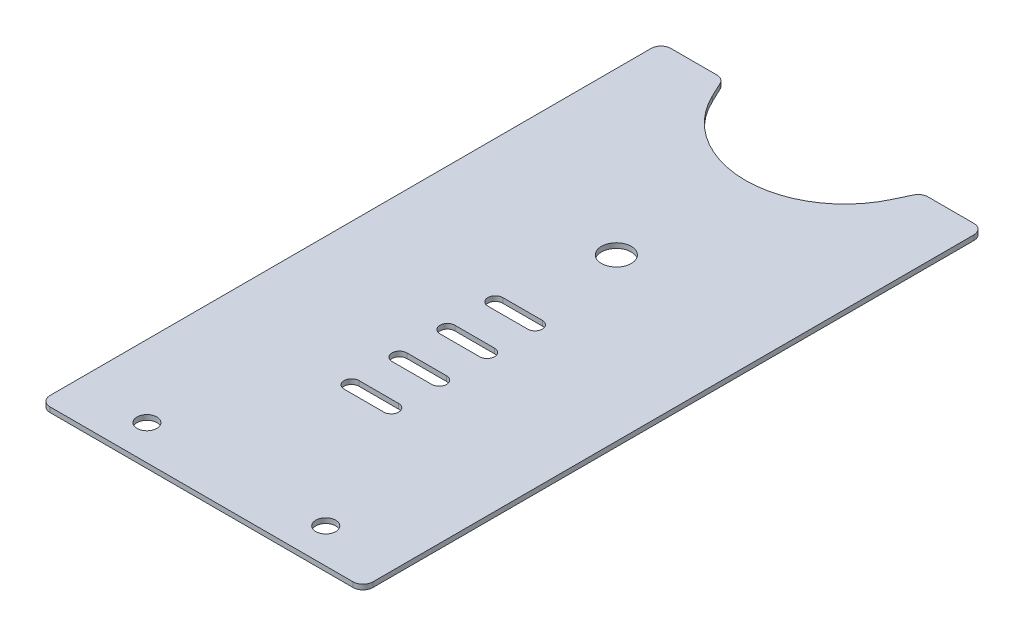
ISO-10303-21;
HEADER;
FILE_DESCRIPTION(('STEP AP214'),'2;1');
FILE_NAME('part.step','',(''),(''),'','','');
FILE_SCHEMA(('AUTOMOTIVE_DESIGN { 1 0 10303 214 1 1 1 1 }'));
ENDSEC;
DATA;
#1=APPLICATION_CONTEXT('core data for automotive mechanical design processes');
#2=APPLICATION_PROTOCOL_DEFINITION('international standard','automotive_design',2000,#1);
#3=PRODUCT_CONTEXT('',#1,'mechanical');
#4=PRODUCT('Part','Part','',(#3));
#5=PRODUCT_RELATED_PRODUCT_CATEGORY('part','',(#4));
#6=PRODUCT_DEFINITION_FORMATION('','',#4);
#7=PRODUCT_DEFINITION_CONTEXT('part definition',#1,'design');
#8=PRODUCT_DEFINITION('design','',#6,#7);
#9=PRODUCT_DEFINITION_SHAPE('','',#8);
#10=(LENGTH_UNIT() NAMED_UNIT(*) SI_UNIT(.MILLI.,.METRE.));
#11=(NAMED_UNIT(*) PLANE_ANGLE_UNIT() SI_UNIT($,.RADIAN.));
#12=(NAMED_UNIT(*) SI_UNIT($,.STERADIAN.) SOLID_ANGLE_UNIT());
#13=UNCERTAINTY_MEASURE_WITH_UNIT(LENGTH_MEASURE(1.E-05),#10,'distance_accuracy_value','');
#14=(GEOMETRIC_REPRESENTATION_CONTEXT(3) GLOBAL_UNCERTAINTY_ASSIGNED_CONTEXT((#13)) GLOBAL_UNIT_ASSIGNED_CONTEXT((#10,
#11,#12)) REPRESENTATION_CONTEXT('',''));
#15=CARTESIAN_POINT('',(0.,0.,0.));
#16=DIRECTION('',(0.,0.,1.));
#17=DIRECTION('',(1.,0.,0.));
#18=AXIS2_PLACEMENT_3D('',#15,#16,#17);
#19=CARTESIAN_POINT('',(0.,1.,-129.5));
#20=DIRECTION('',(0.,1.,0.));
#21=DIRECTION('',(0.,0.,1.));
#22=AXIS2_PLACEMENT_3D('',#19,#20,#21);
#23=PLANE('',#22);
#24=CARTESIAN_POINT('',(-18.,1.,-7.));
#25=DIRECTION('',(0.,1.,0.));
#26=DIRECTION('',(0.,0.,1.));
#27=AXIS2_PLACEMENT_3D('',#24,#25,#26);
#28=CIRCLE('',#27,2.);
#29=CARTESIAN_POINT('',(-18.,1.,-5.));
#30=VERTEX_POINT('',#29);
#31=EDGE_CURVE('E374',#30,#30,#28,.T.);
#32=ORIENTED_EDGE('',*,*,#31,.F.);
#33=EDGE_LOOP('',(#32));
#34=FACE_BOUND('',#33,.T.);
#35=DIRECTION('',(1.,0.,0.));
#36=VECTOR('',#35,1.);
#37=CARTESIAN_POINT('',(-32.5,1.,0.));
#38=LINE('',#37,#36);
#39=CARTESIAN_POINT('',(-30.5,1.,0.));
#40=VERTEX_POINT('',#39);
#41=CARTESIAN_POINT('',(30.5,1.,0.));
#42=VERTEX_POINT('',#41);
#43=EDGE_CURVE('E399',#40,#42,#38,.T.);
#44=ORIENTED_EDGE('',*,*,#43,.T.);
#45=CARTESIAN_POINT('',(30.5,1.,-2.));
#46=DIRECTION('',(0.,1.,0.));
#47=DIRECTION('',(0.,0.,1.));
#48=AXIS2_PLACEMENT_3D('',#45,#46,#47);
#49=CIRCLE('',#48,2.);
#50=CARTESIAN_POINT('',(32.5,1.,-2.));
#51=VERTEX_POINT('',#50);
#52=EDGE_CURVE('E466',#42,#51,#49,.T.);
#53=ORIENTED_EDGE('',*,*,#52,.T.);
#54=DIRECTION('',(0.,0.,-1.));
#55=VECTOR('',#54,1.);
#56=CARTESIAN_POINT('',(32.5,1.,-125.));
#57=LINE('',#56,#55);
#58=CARTESIAN_POINT('',(32.5,1.,-123.));
#59=VERTEX_POINT('',#58);
#60=EDGE_CURVE('E402',#51,#59,#57,.T.);
#61=ORIENTED_EDGE('',*,*,#60,.T.);
#62=CARTESIAN_POINT('',(30.5,1.,-123.));
#63=DIRECTION('',(0.,1.,0.));
#64=DIRECTION('',(0.,0.,1.));
#65=AXIS2_PLACEMENT_3D('',#62,#63,#64);
#66=CIRCLE('',#65,2.);
#67=CARTESIAN_POINT('',(30.5,1.,-125.));
#68=VERTEX_POINT('',#67);
#69=EDGE_CURVE('E463',#59,#68,#66,.T.);
#70=ORIENTED_EDGE('',*,*,#69,.T.);
#71=DIRECTION('',(-1.,0.,0.));
#72=VECTOR('',#71,1.);
#73=CARTESIAN_POINT('',(20.,1.,-125.));
#74=LINE('',#73,#72);
#75=CARTESIAN_POINT('',(21.265306122449,1.,-125.));
#76=VERTEX_POINT('',#75);
#77=EDGE_CURVE('E405',#68,#76,#74,.T.);
#78=ORIENTED_EDGE('',*,*,#77,.T.);
#79=CARTESIAN_POINT('',(21.265306122449,1.,-123.));
#80=DIRECTION('',(0.,1.,0.));
#81=DIRECTION('',(0.,0.,1.));
#82=AXIS2_PLACEMENT_3D('',#79,#80,#81);
#83=CIRCLE('',#82,2.);
#84=CARTESIAN_POINT('',(19.458048537678,1.,-123.856632956573));
#85=VERTEX_POINT('',#84);
#86=EDGE_CURVE('E50',#76,#85,#83,.T.);
#87=ORIENTED_EDGE('',*,*,#86,.T.);
#88=DIRECTION('',(-0.428316478286736,0.,0.903628792385484));
#89=VECTOR('',#88,1.);
#90=CARTESIAN_POINT('',(18.0725758477097,1.,-120.933670434265));
#91=LINE('',#90,#89);
#92=CARTESIAN_POINT('',(18.0725758477097,1.,-120.933670434265));
#93=VERTEX_POINT('',#92);
#94=EDGE_CURVE('E407',#85,#93,#91,.T.);
#95=ORIENTED_EDGE('',*,*,#94,.T.);
#96=CARTESIAN_POINT('',(0.,1.,-129.5));
#97=DIRECTION('',(0.,-1.,0.));
#98=DIRECTION('',(0.,0.,1.));
#99=AXIS2_PLACEMENT_3D('',#96,#97,#98);
#100=CIRCLE('',#99,20.0000000000002);
#101=CARTESIAN_POINT('',(-18.0725758477102,1.,-120.933670434265));
#102=VERTEX_POINT('',#101);
#103=EDGE_CURVE('E386',#93,#102,#100,.T.);
#104=ORIENTED_EDGE('',*,*,#103,.T.);
#105=DIRECTION('',(-0.428316478286648,0.,-0.903628792385526));
#106=VECTOR('',#105,1.);
#107=CARTESIAN_POINT('',(-18.0725758477102,1.,-120.933670434265));
#108=LINE('',#107,#106);
#109=CARTESIAN_POINT('',(-19.4580485376781,1.,-123.856632956573));
#110=VERTEX_POINT('',#109);
#111=EDGE_CURVE('E389',#102,#110,#108,.T.);
#112=ORIENTED_EDGE('',*,*,#111,.T.);
#113=CARTESIAN_POINT('',(-21.2653061224491,1.,-123.));
#114=DIRECTION('',(0.,1.,0.));
#115=DIRECTION('',(0.,0.,1.));
#116=AXIS2_PLACEMENT_3D('',#113,#114,#115);
#117=CIRCLE('',#116,2.);
#118=CARTESIAN_POINT('',(-21.2653061224491,1.,-125.));
#119=VERTEX_POINT('',#118);
#120=EDGE_CURVE('E461',#110,#119,#117,.T.);
#121=ORIENTED_EDGE('',*,*,#120,.T.);
#122=DIRECTION('',(-1.,0.,0.));
#123=VECTOR('',#122,1.);
#124=CARTESIAN_POINT('',(-20.,1.,-125.));
#125=LINE('',#124,#123);
#126=CARTESIAN_POINT('',(-30.5000000000004,1.,-125.));
#127=VERTEX_POINT('',#126);
#128=EDGE_CURVE('E393',#119,#127,#125,.T.);
#129=ORIENTED_EDGE('',*,*,#128,.T.);
#130=CARTESIAN_POINT('',(-30.5000000000004,1.,-123.));
#131=DIRECTION('',(0.,1.,0.));
#132=DIRECTION('',(0.,0.,1.));
#133=AXIS2_PLACEMENT_3D('',#130,#131,#132);
#134=CIRCLE('',#133,2.);
#135=CARTESIAN_POINT('',(-32.5000000000004,1.,-123.));
#136=VERTEX_POINT('',#135);
#137=EDGE_CURVE('E457',#127,#136,#134,.T.);
#138=ORIENTED_EDGE('',*,*,#137,.T.);
#139=DIRECTION('',(0.,0.,1.));
#140=VECTOR('',#139,1.);
#141=CARTESIAN_POINT('',(-32.5000000000004,1.,-125.));
#142=LINE('',#141,#140);
#143=CARTESIAN_POINT('',(-32.5,1.,-1.99999999999999));
#144=VERTEX_POINT('',#143);
#145=EDGE_CURVE('E396',#136,#144,#142,.T.);
#146=ORIENTED_EDGE('',*,*,#145,.T.);
#147=CARTESIAN_POINT('',(-30.5,1.,-2.));
#148=DIRECTION('',(0.,1.,0.));
#149=DIRECTION('',(0.,0.,1.));
#150=AXIS2_PLACEMENT_3D('',#147,#148,#149);
#151=CIRCLE('',#150,2.);
#152=EDGE_CURVE('E459',#144,#40,#151,.T.);
#153=ORIENTED_EDGE('',*,*,#152,.T.);
#154=EDGE_LOOP('',(#44,#53,#61,#70,#78,#87,#95,#104,#112,#121,#129,#138,#146,#153));
#155=FACE_BOUND('',#154,.T.);
#156=CARTESIAN_POINT('',(18.,1.,-7.));
#157=DIRECTION('',(0.,1.,0.));
#158=DIRECTION('',(0.,0.,-1.));
#159=AXIS2_PLACEMENT_3D('',#156,#157,#158);
#160=CIRCLE('',#159,2.);
#161=CARTESIAN_POINT('',(18.,1.,-9.));
#162=VERTEX_POINT('',#161);
#163=EDGE_CURVE('E380',#162,#162,#160,.T.);
#164=ORIENTED_EDGE('',*,*,#163,.F.);
#165=EDGE_LOOP('',(#164));
#166=FACE_BOUND('',#165,.T.);
#167=CARTESIAN_POINT('',(0.,1.,-83.5100000000105));
#168=DIRECTION('',(0.,1.,0.));
#169=DIRECTION('',(0.,0.,1.));
#170=AXIS2_PLACEMENT_3D('',#167,#168,#169);
#171=CIRCLE('',#170,3.);
#172=CARTESIAN_POINT('',(0.,1.,-80.5100000000105));
#173=VERTEX_POINT('',#172);
#174=EDGE_CURVE('E368',#173,#173,#171,.T.);
#175=ORIENTED_EDGE('',*,*,#174,.F.);
#176=EDGE_LOOP('',(#175));
#177=FACE_BOUND('',#176,.T.);
#178=DIRECTION('',(1.,0.,0.));
#179=VECTOR('',#178,1.);
#180=CARTESIAN_POINT('',(-4.00000000000044,1.,-32.6905665119182));
#181=LINE('',#180,#179);
#182=CARTESIAN_POINT('',(-4.00000000000044,1.,-32.6905665119182));
#183=VERTEX_POINT('',#182);
#184=CARTESIAN_POINT('',(4.00000000000044,1.,-32.6905665119182));
#185=VERTEX_POINT('',#184);
#186=EDGE_CURVE('E339',#183,#185,#181,.T.);
#187=ORIENTED_EDGE('',*,*,#186,.F.);
#188=CARTESIAN_POINT('',(-4.00000000000044,1.,-34.1905665119182));
#189=DIRECTION('',(0.,1.,0.));
#190=DIRECTION('',(0.,0.,1.));
#191=AXIS2_PLACEMENT_3D('',#188,#189,#190);
#192=CIRCLE('',#191,1.49999999999999);
#193=CARTESIAN_POINT('',(-4.00000000000044,1.,-35.6905665119182));
#194=VERTEX_POINT('',#193);
#195=EDGE_CURVE('E337',#194,#183,#192,.T.);
#196=ORIENTED_EDGE('',*,*,#195,.F.);
#197=DIRECTION('',(-1.,0.,0.));
#198=VECTOR('',#197,1.);
#199=CARTESIAN_POINT('',(-4.00000000000044,1.,-35.6905665119182));
#200=LINE('',#199,#198);
#201=CARTESIAN_POINT('',(4.00000000000044,1.,-35.6905665119182));
#202=VERTEX_POINT('',#201);
#203=EDGE_CURVE('E345',#202,#194,#200,.T.);
#204=ORIENTED_EDGE('',*,*,#203,.F.);
#205=CARTESIAN_POINT('',(4.00000000000032,1.,-34.1905665119182));
#206=DIRECTION('',(0.,1.,0.));
#207=DIRECTION('',(0.,0.,1.));
#208=AXIS2_PLACEMENT_3D('',#205,#206,#207);
#209=CIRCLE('',#208,1.49999999999999);
#210=EDGE_CURVE('E342',#185,#202,#209,.T.);
#211=ORIENTED_EDGE('',*,*,#210,.F.);
#212=EDGE_LOOP('',(#187,#196,#204,#211));
#213=FACE_BOUND('',#212,.T.);
#214=DIRECTION('',(1.,0.,0.));
#215=VECTOR('',#214,1.);
#216=CARTESIAN_POINT('',(-4.00000000000048,1.,-42.3405663552651));
#217=LINE('',#216,#215);
#218=CARTESIAN_POINT('',(-4.00000000000048,1.,-42.3405663552651));
#219=VERTEX_POINT('',#218);
#220=CARTESIAN_POINT('',(4.00000000000041,1.,-42.3405663552651));
#221=VERTEX_POINT('',#220);
#222=EDGE_CURVE('E308',#219,#221,#217,.T.);
#223=ORIENTED_EDGE('',*,*,#222,.F.);
#224=CARTESIAN_POINT('',(-4.00000000000048,1.,-43.8405663552651));
#225=DIRECTION('',(0.,1.,0.));
#226=DIRECTION('',(0.,0.,1.));
#227=AXIS2_PLACEMENT_3D('',#224,#225,#226);
#228=CIRCLE('',#227,1.5);
#229=CARTESIAN_POINT('',(-4.00000000000048,1.,-45.3405663552651));
#230=VERTEX_POINT('',#229);
#231=EDGE_CURVE('E306',#230,#219,#228,.T.);
#232=ORIENTED_EDGE('',*,*,#231,.F.);
#233=DIRECTION('',(-1.,0.,0.));
#234=VECTOR('',#233,1.);
#235=CARTESIAN_POINT('',(-4.00000000000048,1.,-45.3405663552651));
#236=LINE('',#235,#234);
#237=CARTESIAN_POINT('',(4.00000000000041,1.,-45.3405663552651));
#238=VERTEX_POINT('',#237);
#239=EDGE_CURVE('E314',#238,#230,#236,.T.);
#240=ORIENTED_EDGE('',*,*,#239,.F.);
#241=CARTESIAN_POINT('',(4.00000000000041,1.,-43.8405663552651));
#242=DIRECTION('',(0.,1.,0.));
#243=DIRECTION('',(0.,0.,1.));
#244=AXIS2_PLACEMENT_3D('',#241,#242,#243);
#245=CIRCLE('',#244,1.5);
#246=EDGE_CURVE('E311',#221,#238,#245,.T.);
#247=ORIENTED_EDGE('',*,*,#246,.F.);
#248=EDGE_LOOP('',(#223,#232,#240,#247));
#249=FACE_BOUND('',#248,.T.);
#250=DIRECTION('',(1.,0.,0.));
#251=VECTOR('',#250,1.);
#252=CARTESIAN_POINT('',(-4.00000000000051,1.,-51.990566198612));
#253=LINE('',#252,#251);
#254=CARTESIAN_POINT('',(-4.00000000000051,1.,-51.990566198612));
#255=VERTEX_POINT('',#254);
#256=CARTESIAN_POINT('',(4.00000000000038,1.,-51.990566198612));
#257=VERTEX_POINT('',#256);
#258=EDGE_CURVE('E277',#255,#257,#253,.T.);
#259=ORIENTED_EDGE('',*,*,#258,.F.);
#260=CARTESIAN_POINT('',(-4.00000000000051,1.,-53.490566198612));
#261=DIRECTION('',(0.,1.,0.));
#262=DIRECTION('',(0.,0.,1.));
#263=AXIS2_PLACEMENT_3D('',#260,#261,#262);
#264=CIRCLE('',#263,1.5);
#265=CARTESIAN_POINT('',(-4.00000000000051,1.,-54.9905661986121));
#266=VERTEX_POINT('',#265);
#267=EDGE_CURVE('E275',#266,#255,#264,.T.);
#268=ORIENTED_EDGE('',*,*,#267,.F.);
#269=DIRECTION('',(-1.,0.,0.));
#270=VECTOR('',#269,1.);
#271=CARTESIAN_POINT('',(-4.00000000000051,1.,-54.9905661986121));
#272=LINE('',#271,#270);
#273=CARTESIAN_POINT('',(4.00000000000038,1.,-54.9905661986121));
#274=VERTEX_POINT('',#273);
#275=EDGE_CURVE('E283',#274,#266,#272,.T.);
#276=ORIENTED_EDGE('',*,*,#275,.F.);
#277=CARTESIAN_POINT('',(4.00000000000038,1.,-53.490566198612));
#278=DIRECTION('',(0.,1.,0.));
#279=DIRECTION('',(0.,0.,1.));
#280=AXIS2_PLACEMENT_3D('',#277,#278,#279);
#281=CIRCLE('',#280,1.5);
#282=EDGE_CURVE('E280',#257,#274,#281,.T.);
#283=ORIENTED_EDGE('',*,*,#282,.F.);
#284=EDGE_LOOP('',(#259,#268,#276,#283));
#285=FACE_BOUND('',#284,.T.);
#286=DIRECTION('',(1.,0.,0.));
#287=VECTOR('',#286,1.);
#288=CARTESIAN_POINT('',(-4.00000000000054,1.,-61.640566041959));
#289=LINE('',#288,#287);
#290=CARTESIAN_POINT('',(-4.00000000000054,1.,-61.640566041959));
#291=VERTEX_POINT('',#290);
#292=CARTESIAN_POINT('',(4.00000000000034,1.,-61.6405660419588));
#293=VERTEX_POINT('',#292);
#294=EDGE_CURVE('E244',#291,#293,#289,.T.);
#295=ORIENTED_EDGE('',*,*,#294,.F.);
#296=CARTESIAN_POINT('',(-4.00000000000054,1.,-63.1405660419588));
#297=DIRECTION('',(0.,1.,0.));
#298=DIRECTION('',(0.,0.,1.));
#299=AXIS2_PLACEMENT_3D('',#296,#297,#298);
#300=CIRCLE('',#299,1.5);
#301=CARTESIAN_POINT('',(-4.00000000000054,1.,-64.640566041959));
#302=VERTEX_POINT('',#301);
#303=EDGE_CURVE('E234',#302,#291,#300,.T.);
#304=ORIENTED_EDGE('',*,*,#303,.F.);
#305=DIRECTION('',(-1.,0.,0.));
#306=VECTOR('',#305,1.);
#307=CARTESIAN_POINT('',(-4.00000000000054,1.,-64.640566041959));
#308=LINE('',#307,#306);
#309=CARTESIAN_POINT('',(4.00000000000034,1.,-64.640566041959));
#310=VERTEX_POINT('',#309);
#311=EDGE_CURVE('E259',#310,#302,#308,.T.);
#312=ORIENTED_EDGE('',*,*,#311,.F.);
#313=CARTESIAN_POINT('',(4.00000000000034,1.,-63.1405660419588));
#314=DIRECTION('',(0.,1.,0.));
#315=DIRECTION('',(0.,0.,1.));
#316=AXIS2_PLACEMENT_3D('',#313,#314,#315);
#317=CIRCLE('',#316,1.5);
#318=EDGE_CURVE('E257',#293,#310,#317,.T.);
#319=ORIENTED_EDGE('',*,*,#318,.F.);
#320=EDGE_LOOP('',(#295,#304,#312,#319));
#321=FACE_BOUND('',#320,.T.);
#322=ADVANCED_FACE('F35',(#34,#155,#166,#177,#213,#249,#285,#321),#23,.T.);
#323=CARTESIAN_POINT('',(0.,0.,-129.5));
#324=DIRECTION('',(0.,1.,0.));
#325=DIRECTION('',(0.,0.,1.));
#326=AXIS2_PLACEMENT_3D('',#323,#324,#325);
#327=PLANE('',#326);
#328=CARTESIAN_POINT('',(-4.00000000000051,0.,-53.490566198612));
#329=DIRECTION('',(0.,1.,0.));
#330=DIRECTION('',(0.,0.,1.));
#331=AXIS2_PLACEMENT_3D('',#328,#329,#330);
#332=CIRCLE('',#331,1.5);
#333=CARTESIAN_POINT('',(-4.00000000000051,0.,-54.9905661986121));
#334=VERTEX_POINT('',#333);
#335=CARTESIAN_POINT('',(-4.00000000000051,0.,-51.990566198612));
#336=VERTEX_POINT('',#335);
#337=EDGE_CURVE('E252',#334,#336,#332,.T.);
#338=ORIENTED_EDGE('',*,*,#337,.T.);
#339=DIRECTION('',(1.,0.,0.));
#340=VECTOR('',#339,1.);
#341=CARTESIAN_POINT('',(-4.00000000000051,0.,-51.990566198612));
#342=LINE('',#341,#340);
#343=CARTESIAN_POINT('',(4.00000000000038,0.,-51.990566198612));
#344=VERTEX_POINT('',#343);
#345=EDGE_CURVE('E288',#336,#344,#342,.T.);
#346=ORIENTED_EDGE('',*,*,#345,.T.);
#347=CARTESIAN_POINT('',(4.00000000000038,0.,-53.490566198612));
#348=DIRECTION('',(0.,1.,0.));
#349=DIRECTION('',(0.,0.,1.));
#350=AXIS2_PLACEMENT_3D('',#347,#348,#349);
#351=CIRCLE('',#350,1.5);
#352=CARTESIAN_POINT('',(4.00000000000038,0.,-54.9905661986121));
#353=VERTEX_POINT('',#352);
#354=EDGE_CURVE('E291',#344,#353,#351,.T.);
#355=ORIENTED_EDGE('',*,*,#354,.T.);
#356=DIRECTION('',(-1.,0.,0.));
#357=VECTOR('',#356,1.);
#358=CARTESIAN_POINT('',(-4.00000000000051,0.,-54.9905661986121));
#359=LINE('',#358,#357);
#360=EDGE_CURVE('E278',#353,#334,#359,.T.);
#361=ORIENTED_EDGE('',*,*,#360,.T.);
#362=EDGE_LOOP('',(#338,#346,#355,#361));
#363=FACE_BOUND('',#362,.T.);
#364=CARTESIAN_POINT('',(-4.00000000000044,0.,-34.1905665119182));
#365=DIRECTION('',(0.,1.,0.));
#366=DIRECTION('',(0.,0.,1.));
#367=AXIS2_PLACEMENT_3D('',#364,#365,#366);
#368=CIRCLE('',#367,1.49999999999999);
#369=CARTESIAN_POINT('',(-4.00000000000044,0.,-35.6905665119182));
#370=VERTEX_POINT('',#369);
#371=CARTESIAN_POINT('',(-4.00000000000044,0.,-32.6905665119182));
#372=VERTEX_POINT('',#371);
#373=EDGE_CURVE('E336',#370,#372,#368,.T.);
#374=ORIENTED_EDGE('',*,*,#373,.T.);
#375=DIRECTION('',(1.,0.,0.));
#376=VECTOR('',#375,1.);
#377=CARTESIAN_POINT('',(-4.00000000000044,0.,-32.6905665119182));
#378=LINE('',#377,#376);
#379=CARTESIAN_POINT('',(4.00000000000044,0.,-32.6905665119182));
#380=VERTEX_POINT('',#379);
#381=EDGE_CURVE('E350',#372,#380,#378,.T.);
#382=ORIENTED_EDGE('',*,*,#381,.T.);
#383=CARTESIAN_POINT('',(4.00000000000032,0.,-34.1905665119182));
#384=DIRECTION('',(0.,1.,0.));
#385=DIRECTION('',(0.,0.,1.));
#386=AXIS2_PLACEMENT_3D('',#383,#384,#385);
#387=CIRCLE('',#386,1.49999999999999);
#388=CARTESIAN_POINT('',(4.00000000000044,0.,-35.6905665119182));
#389=VERTEX_POINT('',#388);
#390=EDGE_CURVE('E353',#380,#389,#387,.T.);
#391=ORIENTED_EDGE('',*,*,#390,.T.);
#392=DIRECTION('',(-1.,0.,0.));
#393=VECTOR('',#392,1.);
#394=CARTESIAN_POINT('',(-4.00000000000044,0.,-35.6905665119182));
#395=LINE('',#394,#393);
#396=EDGE_CURVE('E340',#389,#370,#395,.T.);
#397=ORIENTED_EDGE('',*,*,#396,.T.);
#398=EDGE_LOOP('',(#374,#382,#391,#397));
#399=FACE_BOUND('',#398,.T.);
#400=DIRECTION('',(0.,0.,-1.));
#401=VECTOR('',#400,1.);
#402=CARTESIAN_POINT('',(32.5,0.,-125.));
#403=LINE('',#402,#401);
#404=CARTESIAN_POINT('',(32.5,0.,-2.));
#405=VERTEX_POINT('',#404);
#406=CARTESIAN_POINT('',(32.5,0.,-123.));
#407=VERTEX_POINT('',#406);
#408=EDGE_CURVE('E424',#405,#407,#403,.T.);
#409=ORIENTED_EDGE('',*,*,#408,.F.);
#410=CARTESIAN_POINT('',(30.5,0.,-2.));
#411=DIRECTION('',(0.,1.,0.));
#412=DIRECTION('',(0.,0.,1.));
#413=AXIS2_PLACEMENT_3D('',#410,#411,#412);
#414=CIRCLE('',#413,2.);
#415=CARTESIAN_POINT('',(30.5,0.,0.));
#416=VERTEX_POINT('',#415);
#417=EDGE_CURVE('E450',#405,#416,#414,.F.);
#418=ORIENTED_EDGE('',*,*,#417,.T.);
#419=DIRECTION('',(1.,0.,0.));
#420=VECTOR('',#419,1.);
#421=CARTESIAN_POINT('',(-32.5,0.,0.));
#422=LINE('',#421,#420);
#423=CARTESIAN_POINT('',(-30.5,0.,0.));
#424=VERTEX_POINT('',#423);
#425=EDGE_CURVE('E421',#424,#416,#422,.T.);
#426=ORIENTED_EDGE('',*,*,#425,.F.);
#427=CARTESIAN_POINT('',(-30.5,0.,-2.));
#428=DIRECTION('',(0.,1.,0.));
#429=DIRECTION('',(0.,0.,1.));
#430=AXIS2_PLACEMENT_3D('',#427,#428,#429);
#431=CIRCLE('',#430,2.);
#432=CARTESIAN_POINT('',(-32.5,0.,-1.99999999999999));
#433=VERTEX_POINT('',#432);
#434=EDGE_CURVE('E442',#424,#433,#431,.F.);
#435=ORIENTED_EDGE('',*,*,#434,.T.);
#436=DIRECTION('',(0.,0.,1.));
#437=VECTOR('',#436,1.);
#438=CARTESIAN_POINT('',(-32.5000000000004,0.,-125.));
#439=LINE('',#438,#437);
#440=CARTESIAN_POINT('',(-32.5000000000004,0.,-123.));
#441=VERTEX_POINT('',#440);
#442=EDGE_CURVE('E418',#441,#433,#439,.T.);
#443=ORIENTED_EDGE('',*,*,#442,.F.);
#444=CARTESIAN_POINT('',(-30.5000000000004,0.,-123.));
#445=DIRECTION('',(0.,1.,0.));
#446=DIRECTION('',(0.,0.,1.));
#447=AXIS2_PLACEMENT_3D('',#444,#445,#446);
#448=CIRCLE('',#447,2.);
#449=CARTESIAN_POINT('',(-30.5000000000004,0.,-125.));
#450=VERTEX_POINT('',#449);
#451=EDGE_CURVE('E440',#441,#450,#448,.F.);
#452=ORIENTED_EDGE('',*,*,#451,.T.);
#453=DIRECTION('',(-1.,0.,0.));
#454=VECTOR('',#453,1.);
#455=CARTESIAN_POINT('',(-20.,0.,-125.));
#456=LINE('',#455,#454);
#457=CARTESIAN_POINT('',(-21.2653061224491,0.,-125.));
#458=VERTEX_POINT('',#457);
#459=EDGE_CURVE('E415',#458,#450,#456,.T.);
#460=ORIENTED_EDGE('',*,*,#459,.F.);
#461=CARTESIAN_POINT('',(-21.2653061224491,0.,-123.));
#462=DIRECTION('',(0.,1.,0.));
#463=DIRECTION('',(0.,0.,1.));
#464=AXIS2_PLACEMENT_3D('',#461,#462,#463);
#465=CIRCLE('',#464,2.);
#466=CARTESIAN_POINT('',(-19.4580485376781,0.,-123.856632956573));
#467=VERTEX_POINT('',#466);
#468=EDGE_CURVE('E444',#458,#467,#465,.F.);
#469=ORIENTED_EDGE('',*,*,#468,.T.);
#470=DIRECTION('',(-0.428316478286648,0.,-0.903628792385526));
#471=VECTOR('',#470,1.);
#472=CARTESIAN_POINT('',(-18.0725758477102,0.,-120.933670434265));
#473=LINE('',#472,#471);
#474=CARTESIAN_POINT('',(-18.0725758477102,0.,-120.933670434265));
#475=VERTEX_POINT('',#474);
#476=EDGE_CURVE('E412',#475,#467,#473,.T.);
#477=ORIENTED_EDGE('',*,*,#476,.F.);
#478=CARTESIAN_POINT('',(0.,0.,-129.5));
#479=DIRECTION('',(0.,-1.,0.));
#480=DIRECTION('',(0.,0.,1.));
#481=AXIS2_PLACEMENT_3D('',#478,#479,#480);
#482=CIRCLE('',#481,20.0000000000002);
#483=CARTESIAN_POINT('',(18.0725758477097,0.,-120.933670434265));
#484=VERTEX_POINT('',#483);
#485=EDGE_CURVE('E383',#484,#475,#482,.T.);
#486=ORIENTED_EDGE('',*,*,#485,.F.);
#487=DIRECTION('',(-0.428316478286736,0.,0.903628792385484));
#488=VECTOR('',#487,1.);
#489=CARTESIAN_POINT('',(18.0725758477097,0.,-120.933670434265));
#490=LINE('',#489,#488);
#491=CARTESIAN_POINT('',(19.458048537678,0.,-123.856632956573));
#492=VERTEX_POINT('',#491);
#493=EDGE_CURVE('E390',#492,#484,#490,.T.);
#494=ORIENTED_EDGE('',*,*,#493,.F.);
#495=CARTESIAN_POINT('',(21.265306122449,0.,-123.));
#496=DIRECTION('',(0.,1.,0.));
#497=DIRECTION('',(0.,0.,1.));
#498=AXIS2_PLACEMENT_3D('',#495,#496,#497);
#499=CIRCLE('',#498,2.);
#500=CARTESIAN_POINT('',(21.265306122449,0.,-125.));
#501=VERTEX_POINT('',#500);
#502=EDGE_CURVE('E448',#492,#501,#499,.F.);
#503=ORIENTED_EDGE('',*,*,#502,.T.);
#504=DIRECTION('',(-1.,0.,0.));
#505=VECTOR('',#504,1.);
#506=CARTESIAN_POINT('',(20.,0.,-125.));
#507=LINE('',#506,#505);
#508=CARTESIAN_POINT('',(30.5,0.,-125.));
#509=VERTEX_POINT('',#508);
#510=EDGE_CURVE('E427',#509,#501,#507,.T.);
#511=ORIENTED_EDGE('',*,*,#510,.F.);
#512=CARTESIAN_POINT('',(30.5,0.,-123.));
#513=DIRECTION('',(0.,1.,0.));
#514=DIRECTION('',(0.,0.,1.));
#515=AXIS2_PLACEMENT_3D('',#512,#513,#514);
#516=CIRCLE('',#515,2.);
#517=EDGE_CURVE('E446',#509,#407,#516,.F.);
#518=ORIENTED_EDGE('',*,*,#517,.T.);
#519=EDGE_LOOP('',(#409,#418,#426,#435,#443,#452,#460,#469,#477,#486,#494,#503,#511,#518));
#520=FACE_BOUND('',#519,.T.);
#521=CARTESIAN_POINT('',(18.,0.,-7.));
#522=DIRECTION('',(0.,1.,0.));
#523=DIRECTION('',(0.,0.,-1.));
#524=AXIS2_PLACEMENT_3D('',#521,#522,#523);
#525=CIRCLE('',#524,2.);
#526=CARTESIAN_POINT('',(18.,0.,-9.));
#527=VERTEX_POINT('',#526);
#528=EDGE_CURVE('E377',#527,#527,#525,.T.);
#529=ORIENTED_EDGE('',*,*,#528,.T.);
#530=EDGE_LOOP('',(#529));
#531=FACE_BOUND('',#530,.T.);
#532=CARTESIAN_POINT('',(-18.,0.,-7.));
#533=DIRECTION('',(0.,1.,0.));
#534=DIRECTION('',(0.,0.,1.));
#535=AXIS2_PLACEMENT_3D('',#532,#533,#534);
#536=CIRCLE('',#535,2.);
#537=CARTESIAN_POINT('',(-18.,0.,-5.));
#538=VERTEX_POINT('',#537);
#539=EDGE_CURVE('E371',#538,#538,#536,.T.);
#540=ORIENTED_EDGE('',*,*,#539,.T.);
#541=EDGE_LOOP('',(#540));
#542=FACE_BOUND('',#541,.T.);
#543=CARTESIAN_POINT('',(0.,0.,-83.5100000000105));
#544=DIRECTION('',(0.,1.,0.));
#545=DIRECTION('',(0.,0.,1.));
#546=AXIS2_PLACEMENT_3D('',#543,#544,#545);
#547=CIRCLE('',#546,3.);
#548=CARTESIAN_POINT('',(0.,0.,-80.5100000000105));
#549=VERTEX_POINT('',#548);
#550=EDGE_CURVE('E367',#549,#549,#547,.T.);
#551=ORIENTED_EDGE('',*,*,#550,.T.);
#552=EDGE_LOOP('',(#551));
#553=FACE_BOUND('',#552,.T.);
#554=CARTESIAN_POINT('',(-4.00000000000048,0.,-43.8405663552651));
#555=DIRECTION('',(0.,1.,0.));
#556=DIRECTION('',(0.,0.,1.));
#557=AXIS2_PLACEMENT_3D('',#554,#555,#556);
#558=CIRCLE('',#557,1.5);
#559=CARTESIAN_POINT('',(-4.00000000000048,0.,-45.3405663552651));
#560=VERTEX_POINT('',#559);
#561=CARTESIAN_POINT('',(-4.00000000000048,0.,-42.3405663552651));
#562=VERTEX_POINT('',#561);
#563=EDGE_CURVE('E305',#560,#562,#558,.T.);
#564=ORIENTED_EDGE('',*,*,#563,.T.);
#565=DIRECTION('',(1.,0.,0.));
#566=VECTOR('',#565,1.);
#567=CARTESIAN_POINT('',(-4.00000000000048,0.,-42.3405663552651));
#568=LINE('',#567,#566);
#569=CARTESIAN_POINT('',(4.00000000000041,0.,-42.3405663552651));
#570=VERTEX_POINT('',#569);
#571=EDGE_CURVE('E319',#562,#570,#568,.T.);
#572=ORIENTED_EDGE('',*,*,#571,.T.);
#573=CARTESIAN_POINT('',(4.00000000000041,0.,-43.8405663552651));
#574=DIRECTION('',(0.,1.,0.));
#575=DIRECTION('',(0.,0.,1.));
#576=AXIS2_PLACEMENT_3D('',#573,#574,#575);
#577=CIRCLE('',#576,1.5);
#578=CARTESIAN_POINT('',(4.00000000000041,0.,-45.3405663552651));
#579=VERTEX_POINT('',#578);
#580=EDGE_CURVE('E322',#570,#579,#577,.T.);
#581=ORIENTED_EDGE('',*,*,#580,.T.);
#582=DIRECTION('',(-1.,0.,0.));
#583=VECTOR('',#582,1.);
#584=CARTESIAN_POINT('',(-4.00000000000048,0.,-45.3405663552651));
#585=LINE('',#584,#583);
#586=EDGE_CURVE('E309',#579,#560,#585,.T.);
#587=ORIENTED_EDGE('',*,*,#586,.T.);
#588=EDGE_LOOP('',(#564,#572,#581,#587));
#589=FACE_BOUND('',#588,.T.);
#590=CARTESIAN_POINT('',(-4.00000000000054,0.,-63.1405660419588));
#591=DIRECTION('',(0.,1.,0.));
#592=DIRECTION('',(0.,0.,1.));
#593=AXIS2_PLACEMENT_3D('',#590,#591,#592);
#594=CIRCLE('',#593,1.5);
#595=CARTESIAN_POINT('',(-4.00000000000054,0.,-64.640566041959));
#596=VERTEX_POINT('',#595);
#597=CARTESIAN_POINT('',(-4.00000000000054,0.,-61.640566041959));
#598=VERTEX_POINT('',#597);
#599=EDGE_CURVE('E263',#596,#598,#594,.T.);
#600=ORIENTED_EDGE('',*,*,#599,.T.);
#601=DIRECTION('',(1.,0.,0.));
#602=VECTOR('',#601,1.);
#603=CARTESIAN_POINT('',(-4.00000000000054,0.,-61.640566041959));
#604=LINE('',#603,#602);
#605=CARTESIAN_POINT('',(4.00000000000034,0.,-61.6405660419588));
#606=VERTEX_POINT('',#605);
#607=EDGE_CURVE('E251',#598,#606,#604,.T.);
#608=ORIENTED_EDGE('',*,*,#607,.T.);
#609=CARTESIAN_POINT('',(4.00000000000034,0.,-63.1405660419588));
#610=DIRECTION('',(0.,1.,0.));
#611=DIRECTION('',(0.,0.,1.));
#612=AXIS2_PLACEMENT_3D('',#609,#610,#611);
#613=CIRCLE('',#612,1.5);
#614=CARTESIAN_POINT('',(4.00000000000034,0.,-64.640566041959));
#615=VERTEX_POINT('',#614);
#616=EDGE_CURVE('E266',#606,#615,#613,.T.);
#617=ORIENTED_EDGE('',*,*,#616,.T.);
#618=DIRECTION('',(-1.,0.,0.));
#619=VECTOR('',#618,1.);
#620=CARTESIAN_POINT('',(-4.00000000000054,0.,-64.640566041959));
#621=LINE('',#620,#619);
#622=EDGE_CURVE('E245',#615,#596,#621,.T.);
#623=ORIENTED_EDGE('',*,*,#622,.T.);
#624=EDGE_LOOP('',(#600,#608,#617,#623));
#625=FACE_BOUND('',#624,.T.);
#626=ADVANCED_FACE('F492',(#363,#399,#520,#531,#542,#553,#589,#625),#327,.F.);
#627=CARTESIAN_POINT('',(0.,1.,-129.5));
#628=DIRECTION('',(0.,-1.,0.));
#629=DIRECTION('',(0.,0.,-1.));
#630=AXIS2_PLACEMENT_3D('',#627,#628,#629);
#631=CYLINDRICAL_SURFACE('',#630,20.0000000000002);
#632=ORIENTED_EDGE('',*,*,#485,.T.);
#633=DIRECTION('',(0.,-1.,0.));
#634=VECTOR('',#633,1.);
#635=CARTESIAN_POINT('',(-18.0725758477102,1.,-120.933670434265));
#636=LINE('',#635,#634);
#637=EDGE_CURVE('E432',#102,#475,#636,.T.);
#638=ORIENTED_EDGE('',*,*,#637,.F.);
#639=ORIENTED_EDGE('',*,*,#103,.F.);
#640=DIRECTION('',(0.,-1.,0.));
#641=VECTOR('',#640,1.);
#642=CARTESIAN_POINT('',(18.0725758477097,1.,-120.933670434265));
#643=LINE('',#642,#641);
#644=EDGE_CURVE('E409',#93,#484,#643,.T.);
#645=ORIENTED_EDGE('',*,*,#644,.T.);
#646=EDGE_LOOP('',(#632,#638,#639,#645));
#647=FACE_BOUND('',#646,.T.);
#648=ADVANCED_FACE('F529',(#647),#631,.F.);
#649=CARTESIAN_POINT('',(-18.0725758477102,1.,-120.933670434265));
#650=DIRECTION('',(-0.903628792385526,0.,0.428316478286648));
#651=DIRECTION('',(0.428316478286648,0.,0.903628792385526));
#652=AXIS2_PLACEMENT_3D('',#649,#650,#651);
#653=PLANE('',#652);
#654=ORIENTED_EDGE('',*,*,#476,.T.);
#655=DIRECTION('',(0.,-1.,0.));
#656=VECTOR('',#655,1.);
#657=CARTESIAN_POINT('',(-19.4580485376781,1.,-123.856632956573));
#658=LINE('',#657,#656);
#659=EDGE_CURVE('E480',#467,#110,#658,.F.);
#660=ORIENTED_EDGE('',*,*,#659,.T.);
#661=ORIENTED_EDGE('',*,*,#111,.F.);
#662=ORIENTED_EDGE('',*,*,#637,.T.);
#663=EDGE_LOOP('',(#654,#660,#661,#662));
#664=FACE_BOUND('',#663,.T.);
#665=ADVANCED_FACE('F541',(#664),#653,.F.);
#666=CARTESIAN_POINT('',(-20.,1.,-125.));
#667=DIRECTION('',(0.,0.,1.));
#668=DIRECTION('',(1.,0.,0.));
#669=AXIS2_PLACEMENT_3D('',#666,#667,#668);
#670=PLANE('',#669);
#671=ORIENTED_EDGE('',*,*,#128,.F.);
#672=DIRECTION('',(0.,-1.,0.));
#673=VECTOR('',#672,1.);
#674=CARTESIAN_POINT('',(-21.2653061224491,1.,-125.));
#675=LINE('',#674,#673);
#676=EDGE_CURVE('E477',#119,#458,#675,.T.);
#677=ORIENTED_EDGE('',*,*,#676,.T.);
#678=ORIENTED_EDGE('',*,*,#459,.T.);
#679=DIRECTION('',(0.,-1.,0.));
#680=VECTOR('',#679,1.);
#681=CARTESIAN_POINT('',(-30.5000000000004,1.,-125.));
#682=LINE('',#681,#680);
#683=EDGE_CURVE('E475',#450,#127,#682,.F.);
#684=ORIENTED_EDGE('',*,*,#683,.T.);
#685=EDGE_LOOP('',(#671,#677,#678,#684));
#686=FACE_BOUND('',#685,.T.);
#687=ADVANCED_FACE('F539',(#686),#670,.F.);
#688=CARTESIAN_POINT('',(-32.5000000000004,1.,-125.));
#689=DIRECTION('',(1.,0.,0.));
#690=DIRECTION('',(0.,0.,-1.));
#691=AXIS2_PLACEMENT_3D('',#688,#689,#690);
#692=PLANE('',#691);
#693=ORIENTED_EDGE('',*,*,#442,.T.);
#694=DIRECTION('',(0.,-1.,0.));
#695=VECTOR('',#694,1.);
#696=CARTESIAN_POINT('',(-32.5,1.,-1.99999999999999));
#697=LINE('',#696,#695);
#698=EDGE_CURVE('E11',#433,#144,#697,.F.);
#699=ORIENTED_EDGE('',*,*,#698,.T.);
#700=ORIENTED_EDGE('',*,*,#145,.F.);
#701=DIRECTION('',(0.,-1.,0.));
#702=VECTOR('',#701,1.);
#703=CARTESIAN_POINT('',(-32.5000000000004,1.,-123.));
#704=LINE('',#703,#702);
#705=EDGE_CURVE('E43',#136,#441,#704,.T.);
#706=ORIENTED_EDGE('',*,*,#705,.T.);
#707=EDGE_LOOP('',(#693,#699,#700,#706));
#708=FACE_BOUND('',#707,.T.);
#709=ADVANCED_FACE('F486',(#708),#692,.F.);
#710=CARTESIAN_POINT('',(-32.5,1.,0.));
#711=DIRECTION('',(0.,0.,-1.));
#712=DIRECTION('',(-1.,0.,0.));
#713=AXIS2_PLACEMENT_3D('',#710,#711,#712);
#714=PLANE('',#713);
#715=ORIENTED_EDGE('',*,*,#425,.T.);
#716=DIRECTION('',(0.,-1.,0.));
#717=VECTOR('',#716,1.);
#718=CARTESIAN_POINT('',(30.5,1.,0.));
#719=LINE('',#718,#717);
#720=EDGE_CURVE('E455',#416,#42,#719,.F.);
#721=ORIENTED_EDGE('',*,*,#720,.T.);
#722=ORIENTED_EDGE('',*,*,#43,.F.);
#723=DIRECTION('',(0.,-1.,0.));
#724=VECTOR('',#723,1.);
#725=CARTESIAN_POINT('',(-30.5,1.,0.));
#726=LINE('',#725,#724);
#727=EDGE_CURVE('E452',#40,#424,#726,.T.);
#728=ORIENTED_EDGE('',*,*,#727,.T.);
#729=EDGE_LOOP('',(#715,#721,#722,#728));
#730=FACE_BOUND('',#729,.T.);
#731=ADVANCED_FACE('F502',(#730),#714,.F.);
#732=CARTESIAN_POINT('',(32.5,1.,-125.));
#733=DIRECTION('',(-1.,0.,0.));
#734=DIRECTION('',(0.,0.,1.));
#735=AXIS2_PLACEMENT_3D('',#732,#733,#734);
#736=PLANE('',#735);
#737=ORIENTED_EDGE('',*,*,#60,.F.);
#738=DIRECTION('',(0.,-1.,0.));
#739=VECTOR('',#738,1.);
#740=CARTESIAN_POINT('',(32.5,1.,-2.));
#741=LINE('',#740,#739);
#742=EDGE_CURVE('E437',#51,#405,#741,.T.);
#743=ORIENTED_EDGE('',*,*,#742,.T.);
#744=ORIENTED_EDGE('',*,*,#408,.T.);
#745=DIRECTION('',(0.,-1.,0.));
#746=VECTOR('',#745,1.);
#747=CARTESIAN_POINT('',(32.5,1.,-123.));
#748=LINE('',#747,#746);
#749=EDGE_CURVE('E435',#407,#59,#748,.F.);
#750=ORIENTED_EDGE('',*,*,#749,.T.);
#751=EDGE_LOOP('',(#737,#743,#744,#750));
#752=FACE_BOUND('',#751,.T.);
#753=ADVANCED_FACE('F511',(#752),#736,.F.);
#754=CARTESIAN_POINT('',(20.,1.,-125.));
#755=DIRECTION('',(0.,0.,1.));
#756=DIRECTION('',(1.,0.,0.));
#757=AXIS2_PLACEMENT_3D('',#754,#755,#756);
#758=PLANE('',#757);
#759=ORIENTED_EDGE('',*,*,#510,.T.);
#760=DIRECTION('',(0.,-1.,0.));
#761=VECTOR('',#760,1.);
#762=CARTESIAN_POINT('',(21.265306122449,1.,-125.));
#763=LINE('',#762,#761);
#764=EDGE_CURVE('E58',#501,#76,#763,.F.);
#765=ORIENTED_EDGE('',*,*,#764,.T.);
#766=ORIENTED_EDGE('',*,*,#77,.F.);
#767=DIRECTION('',(0.,-1.,0.));
#768=VECTOR('',#767,1.);
#769=CARTESIAN_POINT('',(30.5,1.,-125.));
#770=LINE('',#769,#768);
#771=EDGE_CURVE('E471',#68,#509,#770,.T.);
#772=ORIENTED_EDGE('',*,*,#771,.T.);
#773=EDGE_LOOP('',(#759,#765,#766,#772));
#774=FACE_BOUND('',#773,.T.);
#775=ADVANCED_FACE('F518',(#774),#758,.F.);
#776=CARTESIAN_POINT('',(18.0725758477097,1.,-120.933670434265));
#777=DIRECTION('',(0.903628792385484,0.,0.428316478286736));
#778=DIRECTION('',(0.428316478286736,0.,-0.903628792385484));
#779=AXIS2_PLACEMENT_3D('',#776,#777,#778);
#780=PLANE('',#779);
#781=ORIENTED_EDGE('',*,*,#94,.F.);
#782=DIRECTION('',(0.,-1.,0.));
#783=VECTOR('',#782,1.);
#784=CARTESIAN_POINT('',(19.458048537678,1.,-123.856632956573));
#785=LINE('',#784,#783);
#786=EDGE_CURVE('E468',#85,#492,#785,.T.);
#787=ORIENTED_EDGE('',*,*,#786,.T.);
#788=ORIENTED_EDGE('',*,*,#493,.T.);
#789=ORIENTED_EDGE('',*,*,#644,.F.);
#790=EDGE_LOOP('',(#781,#787,#788,#789));
#791=FACE_BOUND('',#790,.T.);
#792=ADVANCED_FACE('F524',(#791),#780,.F.);
#793=CARTESIAN_POINT('',(18.,1.,-7.));
#794=DIRECTION('',(0.,-1.,0.));
#795=DIRECTION('',(0.,0.,-1.));
#796=AXIS2_PLACEMENT_3D('',#793,#794,#795);
#797=CYLINDRICAL_SURFACE('',#796,2.);
#798=ORIENTED_EDGE('',*,*,#163,.T.);
#799=EDGE_LOOP('',(#798));
#800=FACE_BOUND('',#799,.T.);
#801=ORIENTED_EDGE('',*,*,#528,.F.);
#802=EDGE_LOOP('',(#801));
#803=FACE_BOUND('',#802,.T.);
#804=ADVANCED_FACE('F560',(#800,#803),#797,.F.);
#805=CARTESIAN_POINT('',(-18.,1.,-7.));
#806=DIRECTION('',(0.,-1.,0.));
#807=DIRECTION('',(0.,0.,-1.));
#808=AXIS2_PLACEMENT_3D('',#805,#806,#807);
#809=CYLINDRICAL_SURFACE('',#808,2.);
#810=ORIENTED_EDGE('',*,*,#31,.T.);
#811=EDGE_LOOP('',(#810));
#812=FACE_BOUND('',#811,.T.);
#813=ORIENTED_EDGE('',*,*,#539,.F.);
#814=EDGE_LOOP('',(#813));
#815=FACE_BOUND('',#814,.T.);
#816=ADVANCED_FACE('F599',(#812,#815),#809,.F.);
#817=CARTESIAN_POINT('',(0.,1.,-83.5100000000105));
#818=DIRECTION('',(0.,-1.,0.));
#819=DIRECTION('',(0.,0.,-1.));
#820=AXIS2_PLACEMENT_3D('',#817,#818,#819);
#821=CYLINDRICAL_SURFACE('',#820,3.);
#822=ORIENTED_EDGE('',*,*,#174,.T.);
#823=EDGE_LOOP('',(#822));
#824=FACE_BOUND('',#823,.T.);
#825=ORIENTED_EDGE('',*,*,#550,.F.);
#826=EDGE_LOOP('',(#825));
#827=FACE_BOUND('',#826,.T.);
#828=ADVANCED_FACE('F607',(#824,#827),#821,.F.);
#829=CARTESIAN_POINT('',(-4.00000000000044,1.,-34.1905665119182));
#830=DIRECTION('',(0.,-1.,0.));
#831=DIRECTION('',(0.,0.,-1.));
#832=AXIS2_PLACEMENT_3D('',#829,#830,#831);
#833=CYLINDRICAL_SURFACE('',#832,1.49999999999999);
#834=ORIENTED_EDGE('',*,*,#373,.F.);
#835=DIRECTION('',(0.,-1.,0.));
#836=VECTOR('',#835,1.);
#837=CARTESIAN_POINT('',(-4.00000000000044,1.,-35.6905665119182));
#838=LINE('',#837,#836);
#839=EDGE_CURVE('E347',#194,#370,#838,.T.);
#840=ORIENTED_EDGE('',*,*,#839,.F.);
#841=ORIENTED_EDGE('',*,*,#195,.T.);
#842=DIRECTION('',(0.,-1.,0.));
#843=VECTOR('',#842,1.);
#844=CARTESIAN_POINT('',(-4.00000000000044,1.,-32.6905665119182));
#845=LINE('',#844,#843);
#846=EDGE_CURVE('E364',#183,#372,#845,.T.);
#847=ORIENTED_EDGE('',*,*,#846,.T.);
#848=EDGE_LOOP('',(#834,#840,#841,#847));
#849=FACE_BOUND('',#848,.T.);
#850=ADVANCED_FACE('F614',(#849),#833,.F.);
#851=CARTESIAN_POINT('',(-4.00000000000044,1.,-32.6905665119182));
#852=DIRECTION('',(0.,0.,-1.));
#853=DIRECTION('',(-1.,0.,0.));
#854=AXIS2_PLACEMENT_3D('',#851,#852,#853);
#855=PLANE('',#854);
#856=ORIENTED_EDGE('',*,*,#381,.F.);
#857=ORIENTED_EDGE('',*,*,#846,.F.);
#858=ORIENTED_EDGE('',*,*,#186,.T.);
#859=DIRECTION('',(0.,-1.,0.));
#860=VECTOR('',#859,1.);
#861=CARTESIAN_POINT('',(4.00000000000044,1.,-32.6905665119182));
#862=LINE('',#861,#860);
#863=EDGE_CURVE('E362',#185,#380,#862,.T.);
#864=ORIENTED_EDGE('',*,*,#863,.T.);
#865=EDGE_LOOP('',(#856,#857,#858,#864));
#866=FACE_BOUND('',#865,.T.);
#867=ADVANCED_FACE('F622',(#866),#855,.T.);
#868=CARTESIAN_POINT('',(4.00000000000032,1.,-34.1905665119182));
#869=DIRECTION('',(0.,-1.,0.));
#870=DIRECTION('',(0.,0.,-1.));
#871=AXIS2_PLACEMENT_3D('',#868,#869,#870);
#872=CYLINDRICAL_SURFACE('',#871,1.49999999999999);
#873=ORIENTED_EDGE('',*,*,#390,.F.);
#874=ORIENTED_EDGE('',*,*,#863,.F.);
#875=ORIENTED_EDGE('',*,*,#210,.T.);
#876=DIRECTION('',(0.,-1.,0.));
#877=VECTOR('',#876,1.);
#878=CARTESIAN_POINT('',(4.00000000000044,1.,-35.6905665119182));
#879=LINE('',#878,#877);
#880=EDGE_CURVE('E360',#202,#389,#879,.T.);
#881=ORIENTED_EDGE('',*,*,#880,.T.);
#882=EDGE_LOOP('',(#873,#874,#875,#881));
#883=FACE_BOUND('',#882,.T.);
#884=ADVANCED_FACE('F630',(#883),#872,.F.);
#885=CARTESIAN_POINT('',(-4.00000000000044,1.,-35.6905665119182));
#886=DIRECTION('',(0.,0.,1.));
#887=DIRECTION('',(1.,0.,0.));
#888=AXIS2_PLACEMENT_3D('',#885,#886,#887);
#889=PLANE('',#888);
#890=ORIENTED_EDGE('',*,*,#396,.F.);
#891=ORIENTED_EDGE('',*,*,#880,.F.);
#892=ORIENTED_EDGE('',*,*,#203,.T.);
#893=ORIENTED_EDGE('',*,*,#839,.T.);
#894=EDGE_LOOP('',(#890,#891,#892,#893));
#895=FACE_BOUND('',#894,.T.);
#896=ADVANCED_FACE('F638',(#895),#889,.T.);
#897=CARTESIAN_POINT('',(-4.00000000000048,1.,-43.8405663552651));
#898=DIRECTION('',(0.,-1.,0.));
#899=DIRECTION('',(0.,0.,-1.));
#900=AXIS2_PLACEMENT_3D('',#897,#898,#899);
#901=CYLINDRICAL_SURFACE('',#900,1.5);
#902=ORIENTED_EDGE('',*,*,#563,.F.);
#903=DIRECTION('',(0.,-1.,0.));
#904=VECTOR('',#903,1.);
#905=CARTESIAN_POINT('',(-4.00000000000048,1.,-45.3405663552651));
#906=LINE('',#905,#904);
#907=EDGE_CURVE('E316',#230,#560,#906,.T.);
#908=ORIENTED_EDGE('',*,*,#907,.F.);
#909=ORIENTED_EDGE('',*,*,#231,.T.);
#910=DIRECTION('',(0.,-1.,0.));
#911=VECTOR('',#910,1.);
#912=CARTESIAN_POINT('',(-4.00000000000048,1.,-42.3405663552651));
#913=LINE('',#912,#911);
#914=EDGE_CURVE('E333',#219,#562,#913,.T.);
#915=ORIENTED_EDGE('',*,*,#914,.T.);
#916=EDGE_LOOP('',(#902,#908,#909,#915));
#917=FACE_BOUND('',#916,.T.);
#918=ADVANCED_FACE('F646',(#917),#901,.F.);
#919=CARTESIAN_POINT('',(-4.00000000000048,1.,-42.3405663552651));
#920=DIRECTION('',(0.,0.,-1.));
#921=DIRECTION('',(-1.,0.,0.));
#922=AXIS2_PLACEMENT_3D('',#919,#920,#921);
#923=PLANE('',#922);
#924=ORIENTED_EDGE('',*,*,#571,.F.);
#925=ORIENTED_EDGE('',*,*,#914,.F.);
#926=ORIENTED_EDGE('',*,*,#222,.T.);
#927=DIRECTION('',(0.,-1.,0.));
#928=VECTOR('',#927,1.);
#929=CARTESIAN_POINT('',(4.00000000000041,1.,-42.3405663552651));
#930=LINE('',#929,#928);
#931=EDGE_CURVE('E331',#221,#570,#930,.T.);
#932=ORIENTED_EDGE('',*,*,#931,.T.);
#933=EDGE_LOOP('',(#924,#925,#926,#932));
#934=FACE_BOUND('',#933,.T.);
#935=ADVANCED_FACE('F654',(#934),#923,.T.);
#936=CARTESIAN_POINT('',(4.00000000000041,1.,-43.8405663552651));
#937=DIRECTION('',(0.,-1.,0.));
#938=DIRECTION('',(0.,0.,-1.));
#939=AXIS2_PLACEMENT_3D('',#936,#937,#938);
#940=CYLINDRICAL_SURFACE('',#939,1.5);
#941=ORIENTED_EDGE('',*,*,#580,.F.);
#942=ORIENTED_EDGE('',*,*,#931,.F.);
#943=ORIENTED_EDGE('',*,*,#246,.T.);
#944=DIRECTION('',(0.,-1.,0.));
#945=VECTOR('',#944,1.);
#946=CARTESIAN_POINT('',(4.00000000000041,1.,-45.3405663552651));
#947=LINE('',#946,#945);
#948=EDGE_CURVE('E329',#238,#579,#947,.T.);
#949=ORIENTED_EDGE('',*,*,#948,.T.);
#950=EDGE_LOOP('',(#941,#942,#943,#949));
#951=FACE_BOUND('',#950,.T.);
#952=ADVANCED_FACE('F662',(#951),#940,.F.);
#953=CARTESIAN_POINT('',(-4.00000000000048,1.,-45.3405663552651));
#954=DIRECTION('',(0.,0.,1.));
#955=DIRECTION('',(1.,0.,0.));
#956=AXIS2_PLACEMENT_3D('',#953,#954,#955);
#957=PLANE('',#956);
#958=ORIENTED_EDGE('',*,*,#586,.F.);
#959=ORIENTED_EDGE('',*,*,#948,.F.);
#960=ORIENTED_EDGE('',*,*,#239,.T.);
#961=ORIENTED_EDGE('',*,*,#907,.T.);
#962=EDGE_LOOP('',(#958,#959,#960,#961));
#963=FACE_BOUND('',#962,.T.);
#964=ADVANCED_FACE('F670',(#963),#957,.T.);
#965=CARTESIAN_POINT('',(-4.00000000000051,1.,-53.490566198612));
#966=DIRECTION('',(0.,-1.,0.));
#967=DIRECTION('',(0.,0.,-1.));
#968=AXIS2_PLACEMENT_3D('',#965,#966,#967);
#969=CYLINDRICAL_SURFACE('',#968,1.5);
#970=ORIENTED_EDGE('',*,*,#337,.F.);
#971=DIRECTION('',(0.,-1.,0.));
#972=VECTOR('',#971,1.);
#973=CARTESIAN_POINT('',(-4.00000000000051,1.,-54.9905661986121));
#974=LINE('',#973,#972);
#975=EDGE_CURVE('E285',#266,#334,#974,.T.);
#976=ORIENTED_EDGE('',*,*,#975,.F.);
#977=ORIENTED_EDGE('',*,*,#267,.T.);
#978=DIRECTION('',(0.,-1.,0.));
#979=VECTOR('',#978,1.);
#980=CARTESIAN_POINT('',(-4.00000000000051,1.,-51.990566198612));
#981=LINE('',#980,#979);
#982=EDGE_CURVE('E302',#255,#336,#981,.T.);
#983=ORIENTED_EDGE('',*,*,#982,.T.);
#984=EDGE_LOOP('',(#970,#976,#977,#983));
#985=FACE_BOUND('',#984,.T.);
#986=ADVANCED_FACE('F678',(#985),#969,.F.);
#987=CARTESIAN_POINT('',(-4.00000000000051,1.,-51.990566198612));
#988=DIRECTION('',(0.,0.,-1.));
#989=DIRECTION('',(-1.,0.,0.));
#990=AXIS2_PLACEMENT_3D('',#987,#988,#989);
#991=PLANE('',#990);
#992=ORIENTED_EDGE('',*,*,#345,.F.);
#993=ORIENTED_EDGE('',*,*,#982,.F.);
#994=ORIENTED_EDGE('',*,*,#258,.T.);
#995=DIRECTION('',(0.,-1.,0.));
#996=VECTOR('',#995,1.);
#997=CARTESIAN_POINT('',(4.00000000000038,1.,-51.990566198612));
#998=LINE('',#997,#996);
#999=EDGE_CURVE('E300',#257,#344,#998,.T.);
#1000=ORIENTED_EDGE('',*,*,#999,.T.);
#1001=EDGE_LOOP('',(#992,#993,#994,#1000));
#1002=FACE_BOUND('',#1001,.T.);
#1003=ADVANCED_FACE('F686',(#1002),#991,.T.);
#1004=CARTESIAN_POINT('',(4.00000000000038,1.,-53.490566198612));
#1005=DIRECTION('',(0.,-1.,0.));
#1006=DIRECTION('',(0.,0.,-1.));
#1007=AXIS2_PLACEMENT_3D('',#1004,#1005,#1006);
#1008=CYLINDRICAL_SURFACE('',#1007,1.5);
#1009=ORIENTED_EDGE('',*,*,#354,.F.);
#1010=ORIENTED_EDGE('',*,*,#999,.F.);
#1011=ORIENTED_EDGE('',*,*,#282,.T.);
#1012=DIRECTION('',(0.,-1.,0.));
#1013=VECTOR('',#1012,1.);
#1014=CARTESIAN_POINT('',(4.00000000000038,1.,-54.9905661986121));
#1015=LINE('',#1014,#1013);
#1016=EDGE_CURVE('E298',#274,#353,#1015,.T.);
#1017=ORIENTED_EDGE('',*,*,#1016,.T.);
#1018=EDGE_LOOP('',(#1009,#1010,#1011,#1017));
#1019=FACE_BOUND('',#1018,.T.);
#1020=ADVANCED_FACE('F694',(#1019),#1008,.F.);
#1021=CARTESIAN_POINT('',(-4.00000000000051,1.,-54.9905661986121));
#1022=DIRECTION('',(0.,0.,1.));
#1023=DIRECTION('',(1.,0.,0.));
#1024=AXIS2_PLACEMENT_3D('',#1021,#1022,#1023);
#1025=PLANE('',#1024);
#1026=ORIENTED_EDGE('',*,*,#360,.F.);
#1027=ORIENTED_EDGE('',*,*,#1016,.F.);
#1028=ORIENTED_EDGE('',*,*,#275,.T.);
#1029=ORIENTED_EDGE('',*,*,#975,.T.);
#1030=EDGE_LOOP('',(#1026,#1027,#1028,#1029));
#1031=FACE_BOUND('',#1030,.T.);
#1032=ADVANCED_FACE('F702',(#1031),#1025,.T.);
#1033=CARTESIAN_POINT('',(-4.00000000000054,1.,-63.1405660419588));
#1034=DIRECTION('',(0.,-1.,0.));
#1035=DIRECTION('',(0.,0.,-1.));
#1036=AXIS2_PLACEMENT_3D('',#1033,#1034,#1035);
#1037=CYLINDRICAL_SURFACE('',#1036,1.5);
#1038=ORIENTED_EDGE('',*,*,#599,.F.);
#1039=DIRECTION('',(0.,-1.,0.));
#1040=VECTOR('',#1039,1.);
#1041=CARTESIAN_POINT('',(-4.00000000000054,1.,-64.640566041959));
#1042=LINE('',#1041,#1040);
#1043=EDGE_CURVE('E240',#302,#596,#1042,.T.);
#1044=ORIENTED_EDGE('',*,*,#1043,.F.);
#1045=ORIENTED_EDGE('',*,*,#303,.T.);
#1046=DIRECTION('',(0.,-1.,0.));
#1047=VECTOR('',#1046,1.);
#1048=CARTESIAN_POINT('',(-4.00000000000054,1.,-61.640566041959));
#1049=LINE('',#1048,#1047);
#1050=EDGE_CURVE('E237',#291,#598,#1049,.T.);
#1051=ORIENTED_EDGE('',*,*,#1050,.T.);
#1052=EDGE_LOOP('',(#1038,#1044,#1045,#1051));
#1053=FACE_BOUND('',#1052,.T.);
#1054=ADVANCED_FACE('F236',(#1053),#1037,.F.);
#1055=CARTESIAN_POINT('',(-4.00000000000054,1.,-61.640566041959));
#1056=DIRECTION('',(0.,0.,-1.));
#1057=DIRECTION('',(-1.,0.,0.));
#1058=AXIS2_PLACEMENT_3D('',#1055,#1056,#1057);
#1059=PLANE('',#1058);
#1060=ORIENTED_EDGE('',*,*,#607,.F.);
#1061=ORIENTED_EDGE('',*,*,#1050,.F.);
#1062=ORIENTED_EDGE('',*,*,#294,.T.);
#1063=DIRECTION('',(0.,-1.,0.));
#1064=VECTOR('',#1063,1.);
#1065=CARTESIAN_POINT('',(4.00000000000034,1.,-61.6405660419588));
#1066=LINE('',#1065,#1064);
#1067=EDGE_CURVE('E253',#293,#606,#1066,.T.);
#1068=ORIENTED_EDGE('',*,*,#1067,.T.);
#1069=EDGE_LOOP('',(#1060,#1061,#1062,#1068));
#1070=FACE_BOUND('',#1069,.T.);
#1071=ADVANCED_FACE('F248',(#1070),#1059,.T.);
#1072=CARTESIAN_POINT('',(4.00000000000034,1.,-63.1405660419588));
#1073=DIRECTION('',(0.,-1.,0.));
#1074=DIRECTION('',(0.,0.,-1.));
#1075=AXIS2_PLACEMENT_3D('',#1072,#1073,#1074);
#1076=CYLINDRICAL_SURFACE('',#1075,1.5);
#1077=ORIENTED_EDGE('',*,*,#616,.F.);
#1078=ORIENTED_EDGE('',*,*,#1067,.F.);
#1079=ORIENTED_EDGE('',*,*,#318,.T.);
#1080=DIRECTION('',(0.,-1.,0.));
#1081=VECTOR('',#1080,1.);
#1082=CARTESIAN_POINT('',(4.00000000000034,1.,-64.640566041959));
#1083=LINE('',#1082,#1081);
#1084=EDGE_CURVE('E272',#310,#615,#1083,.T.);
#1085=ORIENTED_EDGE('',*,*,#1084,.T.);
#1086=EDGE_LOOP('',(#1077,#1078,#1079,#1085));
#1087=FACE_BOUND('',#1086,.T.);
#1088=ADVANCED_FACE('F723',(#1087),#1076,.F.);
#1089=CARTESIAN_POINT('',(-4.00000000000054,1.,-64.640566041959));
#1090=DIRECTION('',(0.,0.,1.));
#1091=DIRECTION('',(1.,0.,0.));
#1092=AXIS2_PLACEMENT_3D('',#1089,#1090,#1091);
#1093=PLANE('',#1092);
#1094=ORIENTED_EDGE('',*,*,#622,.F.);
#1095=ORIENTED_EDGE('',*,*,#1084,.F.);
#1096=ORIENTED_EDGE('',*,*,#311,.T.);
#1097=ORIENTED_EDGE('',*,*,#1043,.T.);
#1098=EDGE_LOOP('',(#1094,#1095,#1096,#1097));
#1099=FACE_BOUND('',#1098,.T.);
#1100=ADVANCED_FACE('F730',(#1099),#1093,.T.);
#1101=CARTESIAN_POINT('',(30.5,1.,-2.));
#1102=DIRECTION('',(0.,-1.,0.));
#1103=DIRECTION('',(0.,0.,-1.));
#1104=AXIS2_PLACEMENT_3D('',#1101,#1102,#1103);
#1105=CYLINDRICAL_SURFACE('',#1104,2.);
#1106=ORIENTED_EDGE('',*,*,#52,.F.);
#1107=ORIENTED_EDGE('',*,*,#720,.F.);
#1108=ORIENTED_EDGE('',*,*,#417,.F.);
#1109=ORIENTED_EDGE('',*,*,#742,.F.);
#1110=EDGE_LOOP('',(#1106,#1107,#1108,#1109));
#1111=FACE_BOUND('',#1110,.T.);
#1112=ADVANCED_FACE('F509',(#1111),#1105,.T.);
#1113=CARTESIAN_POINT('',(21.265306122449,1.,-123.));
#1114=DIRECTION('',(0.,-1.,0.));
#1115=DIRECTION('',(0.,0.,-1.));
#1116=AXIS2_PLACEMENT_3D('',#1113,#1114,#1115);
#1117=CYLINDRICAL_SURFACE('',#1116,2.);
#1118=ORIENTED_EDGE('',*,*,#86,.F.);
#1119=ORIENTED_EDGE('',*,*,#764,.F.);
#1120=ORIENTED_EDGE('',*,*,#502,.F.);
#1121=ORIENTED_EDGE('',*,*,#786,.F.);
#1122=EDGE_LOOP('',(#1118,#1119,#1120,#1121));
#1123=FACE_BOUND('',#1122,.T.);
#1124=ADVANCED_FACE('F521',(#1123),#1117,.T.);
#1125=CARTESIAN_POINT('',(30.5,1.,-123.));
#1126=DIRECTION('',(0.,-1.,0.));
#1127=DIRECTION('',(0.,0.,-1.));
#1128=AXIS2_PLACEMENT_3D('',#1125,#1126,#1127);
#1129=CYLINDRICAL_SURFACE('',#1128,2.);
#1130=ORIENTED_EDGE('',*,*,#69,.F.);
#1131=ORIENTED_EDGE('',*,*,#749,.F.);
#1132=ORIENTED_EDGE('',*,*,#517,.F.);
#1133=ORIENTED_EDGE('',*,*,#771,.F.);
#1134=EDGE_LOOP('',(#1130,#1131,#1132,#1133));
#1135=FACE_BOUND('',#1134,.T.);
#1136=ADVANCED_FACE('F517',(#1135),#1129,.T.);
#1137=CARTESIAN_POINT('',(-21.2653061224491,1.,-123.));
#1138=DIRECTION('',(0.,-1.,0.));
#1139=DIRECTION('',(0.,0.,-1.));
#1140=AXIS2_PLACEMENT_3D('',#1137,#1138,#1139);
#1141=CYLINDRICAL_SURFACE('',#1140,2.);
#1142=ORIENTED_EDGE('',*,*,#120,.F.);
#1143=ORIENTED_EDGE('',*,*,#659,.F.);
#1144=ORIENTED_EDGE('',*,*,#468,.F.);
#1145=ORIENTED_EDGE('',*,*,#676,.F.);
#1146=EDGE_LOOP('',(#1142,#1143,#1144,#1145));
#1147=FACE_BOUND('',#1146,.T.);
#1148=ADVANCED_FACE('F537',(#1147),#1141,.T.);
#1149=CARTESIAN_POINT('',(-30.5,1.,-2.));
#1150=DIRECTION('',(0.,-1.,0.));
#1151=DIRECTION('',(0.,0.,-1.));
#1152=AXIS2_PLACEMENT_3D('',#1149,#1150,#1151);
#1153=CYLINDRICAL_SURFACE('',#1152,2.);
#1154=ORIENTED_EDGE('',*,*,#152,.F.);
#1155=ORIENTED_EDGE('',*,*,#698,.F.);
#1156=ORIENTED_EDGE('',*,*,#434,.F.);
#1157=ORIENTED_EDGE('',*,*,#727,.F.);
#1158=EDGE_LOOP('',(#1154,#1155,#1156,#1157));
#1159=FACE_BOUND('',#1158,.T.);
#1160=ADVANCED_FACE('F499',(#1159),#1153,.T.);
#1161=CARTESIAN_POINT('',(-30.5000000000004,1.,-123.));
#1162=DIRECTION('',(0.,-1.,0.));
#1163=DIRECTION('',(0.,0.,-1.));
#1164=AXIS2_PLACEMENT_3D('',#1161,#1162,#1163);
#1165=CYLINDRICAL_SURFACE('',#1164,2.);
#1166=ORIENTED_EDGE('',*,*,#137,.F.);
#1167=ORIENTED_EDGE('',*,*,#683,.F.);
#1168=ORIENTED_EDGE('',*,*,#451,.F.);
#1169=ORIENTED_EDGE('',*,*,#705,.F.);
#1170=EDGE_LOOP('',(#1166,#1167,#1168,#1169));
#1171=FACE_BOUND('',#1170,.T.);
#1172=ADVANCED_FACE('F37',(#1171),#1165,.T.);
#1173=CLOSED_SHELL('',(#322,#626,#648,#665,#687,#709,#731,#753,#775,#792,#804,#816,#828,#850,
#867,#884,#896,#918,#935,#952,#964,#986,#1003,#1020,#1032,#1054,#1071,#1088,#1100,#1112,#1124,
#1136,#1148,#1160,#1172));
#1174=MANIFOLD_SOLID_BREP('B2',#1173);
#1175=ADVANCED_BREP_SHAPE_REPRESENTATION('',(#18,#1174),#14);
#1176=SHAPE_DEFINITION_REPRESENTATION(#9,#1175);
ENDSEC;
END-ISO-10303-21;
